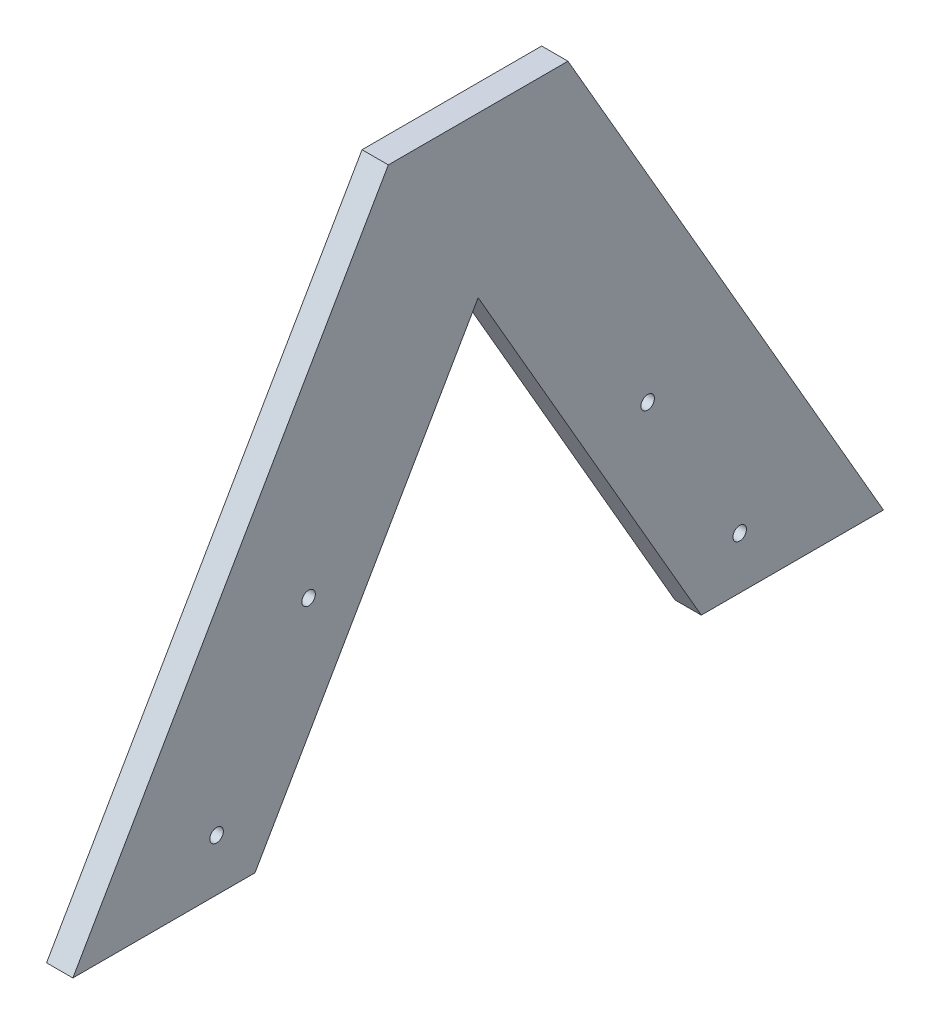
ISO-10303-21;
HEADER;
FILE_DESCRIPTION(('STEP AP214'),'2;1');
FILE_NAME('part.step','',(''),(''),'','','');
FILE_SCHEMA(('AUTOMOTIVE_DESIGN { 1 0 10303 214 1 1 1 1 }'));
ENDSEC;
DATA;
#1=APPLICATION_CONTEXT('core data for automotive mechanical design processes');
#2=APPLICATION_PROTOCOL_DEFINITION('international standard','automotive_design',2000,#1);
#3=PRODUCT_CONTEXT('',#1,'mechanical');
#4=PRODUCT('Part','Part','',(#3));
#5=PRODUCT_RELATED_PRODUCT_CATEGORY('part','',(#4));
#6=PRODUCT_DEFINITION_FORMATION('','',#4);
#7=PRODUCT_DEFINITION_CONTEXT('part definition',#1,'design');
#8=PRODUCT_DEFINITION('design','',#6,#7);
#9=PRODUCT_DEFINITION_SHAPE('','',#8);
#10=(LENGTH_UNIT() NAMED_UNIT(*) SI_UNIT(.MILLI.,.METRE.));
#11=(NAMED_UNIT(*) PLANE_ANGLE_UNIT() SI_UNIT($,.RADIAN.));
#12=(NAMED_UNIT(*) SI_UNIT($,.STERADIAN.) SOLID_ANGLE_UNIT());
#13=UNCERTAINTY_MEASURE_WITH_UNIT(LENGTH_MEASURE(1.E-05),#10,'distance_accuracy_value','');
#14=(GEOMETRIC_REPRESENTATION_CONTEXT(3) GLOBAL_UNCERTAINTY_ASSIGNED_CONTEXT((#13)) GLOBAL_UNIT_ASSIGNED_CONTEXT((#10,
#11,#12)) REPRESENTATION_CONTEXT('',''));
#15=CARTESIAN_POINT('',(0.,0.,0.));
#16=DIRECTION('',(0.,0.,1.));
#17=DIRECTION('',(1.,0.,0.));
#18=AXIS2_PLACEMENT_3D('',#15,#16,#17);
#19=CARTESIAN_POINT('',(6.35,0.,0.));
#20=DIRECTION('',(0.,1.,0.));
#21=DIRECTION('',(0.,0.,1.));
#22=AXIS2_PLACEMENT_3D('',#19,#20,#21);
#23=PLANE('',#22);
#24=DIRECTION('',(0.,0.,-1.));
#25=VECTOR('',#24,1.);
#26=CARTESIAN_POINT('',(0.,0.,0.));
#27=LINE('',#26,#25);
#28=CARTESIAN_POINT('',(0.,0.,0.));
#29=VERTEX_POINT('',#28);
#30=CARTESIAN_POINT('',(0.,0.,-43.9940905122494));
#31=VERTEX_POINT('',#30);
#32=EDGE_CURVE('E135',#29,#31,#27,.T.);
#33=ORIENTED_EDGE('',*,*,#32,.T.);
#34=DIRECTION('',(-1.,0.,0.));
#35=VECTOR('',#34,1.);
#36=CARTESIAN_POINT('',(6.35,0.,-43.9940905122494));
#37=LINE('',#36,#35);
#38=CARTESIAN_POINT('',(6.35,0.,-43.9940905122494));
#39=VERTEX_POINT('',#38);
#40=EDGE_CURVE('E11',#39,#31,#37,.T.);
#41=ORIENTED_EDGE('',*,*,#40,.F.);
#42=DIRECTION('',(0.,0.,-1.));
#43=VECTOR('',#42,1.);
#44=CARTESIAN_POINT('',(6.35,0.,0.));
#45=LINE('',#44,#43);
#46=CARTESIAN_POINT('',(6.35,0.,0.));
#47=VERTEX_POINT('',#46);
#48=EDGE_CURVE('E151',#47,#39,#45,.T.);
#49=ORIENTED_EDGE('',*,*,#48,.F.);
#50=DIRECTION('',(-1.,0.,0.));
#51=VECTOR('',#50,1.);
#52=CARTESIAN_POINT('',(6.35,0.,0.));
#53=LINE('',#52,#51);
#54=EDGE_CURVE('E131',#47,#29,#53,.T.);
#55=ORIENTED_EDGE('',*,*,#54,.T.);
#56=EDGE_LOOP('',(#33,#41,#49,#55));
#57=FACE_BOUND('',#56,.T.);
#58=ADVANCED_FACE('F39',(#57),#23,.F.);
#59=CARTESIAN_POINT('',(6.35,0.,-43.9940905122494));
#60=DIRECTION('',(0.,0.499999999999996,0.866025403784441));
#61=DIRECTION('',(0.,-0.866025403784441,0.499999999999996));
#62=AXIS2_PLACEMENT_3D('',#59,#60,#61);
#63=PLANE('',#62);
#64=DIRECTION('',(0.,0.866025403784441,-0.499999999999996));
#65=VECTOR('',#64,1.);
#66=CARTESIAN_POINT('',(0.,0.,-43.9940905122494));
#67=LINE('',#66,#65);
#68=CARTESIAN_POINT('',(0.,93.3557217066508,-97.8930415699754));
#69=VERTEX_POINT('',#68);
#70=EDGE_CURVE('E139',#31,#69,#67,.T.);
#71=ORIENTED_EDGE('',*,*,#70,.T.);
#72=DIRECTION('',(-1.,0.,0.));
#73=VECTOR('',#72,1.);
#74=CARTESIAN_POINT('',(6.35,93.3557217066508,-97.8930415699754));
#75=LINE('',#74,#73);
#76=CARTESIAN_POINT('',(6.35,93.3557217066508,-97.8930415699754));
#77=VERTEX_POINT('',#76);
#78=EDGE_CURVE('E48',#77,#69,#75,.T.);
#79=ORIENTED_EDGE('',*,*,#78,.F.);
#80=DIRECTION('',(0.,0.866025403784441,-0.499999999999996));
#81=VECTOR('',#80,1.);
#82=CARTESIAN_POINT('',(6.35,0.,-43.9940905122494));
#83=LINE('',#82,#81);
#84=EDGE_CURVE('E100',#39,#77,#83,.T.);
#85=ORIENTED_EDGE('',*,*,#84,.F.);
#86=ORIENTED_EDGE('',*,*,#40,.T.);
#87=EDGE_LOOP('',(#71,#79,#85,#86));
#88=FACE_BOUND('',#87,.T.);
#89=ADVANCED_FACE('F244',(#88),#63,.F.);
#90=CARTESIAN_POINT('',(6.35,93.3557217066508,-97.8930415699754));
#91=DIRECTION('',(0.,0.499999999999998,-0.86602540378444));
#92=DIRECTION('',(0.,0.86602540378444,0.499999999999998));
#93=AXIS2_PLACEMENT_3D('',#90,#91,#92);
#94=PLANE('',#93);
#95=DIRECTION('',(0.,-0.86602540378444,-0.499999999999998));
#96=VECTOR('',#95,1.);
#97=CARTESIAN_POINT('',(0.,93.3557217066508,-97.8930415699754));
#98=LINE('',#97,#96);
#99=CARTESIAN_POINT('',(0.,-3.8421819742332E-13,-151.791992627702));
#100=VERTEX_POINT('',#99);
#101=EDGE_CURVE('E143',#69,#100,#98,.T.);
#102=ORIENTED_EDGE('',*,*,#101,.T.);
#103=DIRECTION('',(-1.,0.,0.));
#104=VECTOR('',#103,1.);
#105=CARTESIAN_POINT('',(6.35,-3.8421819742332E-13,-151.791992627702));
#106=LINE('',#105,#104);
#107=CARTESIAN_POINT('',(6.35,-3.8421819742332E-13,-151.791992627702));
#108=VERTEX_POINT('',#107);
#109=EDGE_CURVE('E156',#108,#100,#106,.T.);
#110=ORIENTED_EDGE('',*,*,#109,.F.);
#111=DIRECTION('',(0.,-0.86602540378444,-0.499999999999998));
#112=VECTOR('',#111,1.);
#113=CARTESIAN_POINT('',(6.35,93.3557217066508,-97.8930415699754));
#114=LINE('',#113,#112);
#115=EDGE_CURVE('E164',#77,#108,#114,.T.);
#116=ORIENTED_EDGE('',*,*,#115,.F.);
#117=ORIENTED_EDGE('',*,*,#78,.T.);
#118=EDGE_LOOP('',(#102,#110,#116,#117));
#119=FACE_BOUND('',#118,.T.);
#120=ADVANCED_FACE('F162',(#119),#94,.F.);
#121=CARTESIAN_POINT('',(6.35,-3.8421819742332E-13,-151.791992627702));
#122=DIRECTION('',(0.,1.,0.));
#123=DIRECTION('',(0.,0.,1.));
#124=AXIS2_PLACEMENT_3D('',#121,#122,#123);
#125=PLANE('',#124);
#126=DIRECTION('',(0.,0.,-1.));
#127=VECTOR('',#126,1.);
#128=CARTESIAN_POINT('',(0.,-3.8421819742332E-13,-151.791992627702));
#129=LINE('',#128,#127);
#130=CARTESIAN_POINT('',(0.,-3.8421819742332E-13,-195.786083139951));
#131=VERTEX_POINT('',#130);
#132=EDGE_CURVE('E145',#100,#131,#129,.T.);
#133=ORIENTED_EDGE('',*,*,#132,.T.);
#134=DIRECTION('',(-1.,0.,0.));
#135=VECTOR('',#134,1.);
#136=CARTESIAN_POINT('',(6.35,-3.8421819742332E-13,-195.786083139951));
#137=LINE('',#136,#135);
#138=CARTESIAN_POINT('',(6.35,-3.8421819742332E-13,-195.786083139951));
#139=VERTEX_POINT('',#138);
#140=EDGE_CURVE('E125',#139,#131,#137,.T.);
#141=ORIENTED_EDGE('',*,*,#140,.F.);
#142=DIRECTION('',(0.,0.,-1.));
#143=VECTOR('',#142,1.);
#144=CARTESIAN_POINT('',(6.35,-3.8421819742332E-13,-151.791992627702));
#145=LINE('',#144,#143);
#146=EDGE_CURVE('E116',#108,#139,#145,.T.);
#147=ORIENTED_EDGE('',*,*,#146,.F.);
#148=ORIENTED_EDGE('',*,*,#109,.T.);
#149=EDGE_LOOP('',(#133,#141,#147,#148));
#150=FACE_BOUND('',#149,.T.);
#151=ADVANCED_FACE('F170',(#150),#125,.F.);
#152=CARTESIAN_POINT('',(6.35,131.982271536748,-119.586083139952));
#153=DIRECTION('',(0.,-0.499999999999996,0.866025403784441));
#154=DIRECTION('',(0.,-0.866025403784441,-0.499999999999996));
#155=AXIS2_PLACEMENT_3D('',#152,#153,#154);
#156=PLANE('',#155);
#157=DIRECTION('',(0.,0.866025403784441,0.499999999999996));
#158=VECTOR('',#157,1.);
#159=CARTESIAN_POINT('',(0.,131.982271536748,-119.586083139952));
#160=LINE('',#159,#158);
#161=CARTESIAN_POINT('',(0.,131.982271536748,-119.586083139952));
#162=VERTEX_POINT('',#161);
#163=EDGE_CURVE('E124',#131,#162,#160,.T.);
#164=ORIENTED_EDGE('',*,*,#163,.T.);
#165=DIRECTION('',(-1.,0.,0.));
#166=VECTOR('',#165,1.);
#167=CARTESIAN_POINT('',(6.35,131.982271536748,-119.586083139952));
#168=LINE('',#167,#166);
#169=CARTESIAN_POINT('',(6.35,131.982271536748,-119.586083139952));
#170=VERTEX_POINT('',#169);
#171=EDGE_CURVE('E121',#170,#162,#168,.T.);
#172=ORIENTED_EDGE('',*,*,#171,.F.);
#173=DIRECTION('',(0.,0.866025403784441,0.499999999999996));
#174=VECTOR('',#173,1.);
#175=CARTESIAN_POINT('',(6.35,131.982271536748,-119.586083139952));
#176=LINE('',#175,#174);
#177=EDGE_CURVE('E110',#139,#170,#176,.T.);
#178=ORIENTED_EDGE('',*,*,#177,.F.);
#179=ORIENTED_EDGE('',*,*,#140,.T.);
#180=EDGE_LOOP('',(#164,#172,#178,#179));
#181=FACE_BOUND('',#180,.T.);
#182=ADVANCED_FACE('F122',(#181),#156,.F.);
#183=CARTESIAN_POINT('',(6.35,131.982271536748,-76.2));
#184=DIRECTION('',(0.,-1.,0.));
#185=DIRECTION('',(0.,0.,-1.));
#186=AXIS2_PLACEMENT_3D('',#183,#184,#185);
#187=PLANE('',#186);
#188=DIRECTION('',(0.,0.,1.));
#189=VECTOR('',#188,1.);
#190=CARTESIAN_POINT('',(0.,131.982271536748,-76.2));
#191=LINE('',#190,#189);
#192=CARTESIAN_POINT('',(0.,131.982271536748,-76.2));
#193=VERTEX_POINT('',#192);
#194=EDGE_CURVE('E85',#162,#193,#191,.T.);
#195=ORIENTED_EDGE('',*,*,#194,.T.);
#196=DIRECTION('',(-1.,0.,0.));
#197=VECTOR('',#196,1.);
#198=CARTESIAN_POINT('',(6.35,131.982271536748,-76.2));
#199=LINE('',#198,#197);
#200=CARTESIAN_POINT('',(6.35,131.982271536748,-76.2));
#201=VERTEX_POINT('',#200);
#202=EDGE_CURVE('E126',#201,#193,#199,.T.);
#203=ORIENTED_EDGE('',*,*,#202,.F.);
#204=DIRECTION('',(0.,0.,1.));
#205=VECTOR('',#204,1.);
#206=CARTESIAN_POINT('',(6.35,131.982271536748,-76.2));
#207=LINE('',#206,#205);
#208=EDGE_CURVE('E114',#170,#201,#207,.T.);
#209=ORIENTED_EDGE('',*,*,#208,.F.);
#210=ORIENTED_EDGE('',*,*,#171,.T.);
#211=EDGE_LOOP('',(#195,#203,#209,#210));
#212=FACE_BOUND('',#211,.T.);
#213=ADVANCED_FACE('F128',(#212),#187,.F.);
#214=CARTESIAN_POINT('',(6.35,0.,0.));
#215=DIRECTION('',(0.,-0.5,-0.866025403784439));
#216=DIRECTION('',(0.,0.866025403784439,-0.5));
#217=AXIS2_PLACEMENT_3D('',#214,#215,#216);
#218=PLANE('',#217);
#219=DIRECTION('',(0.,-0.866025403784439,0.5));
#220=VECTOR('',#219,1.);
#221=CARTESIAN_POINT('',(0.,0.,0.));
#222=LINE('',#221,#220);
#223=EDGE_CURVE('E91',#193,#29,#222,.T.);
#224=ORIENTED_EDGE('',*,*,#223,.T.);
#225=ORIENTED_EDGE('',*,*,#54,.F.);
#226=DIRECTION('',(0.,-0.866025403784439,0.5));
#227=VECTOR('',#226,1.);
#228=CARTESIAN_POINT('',(6.35,0.,0.));
#229=LINE('',#228,#227);
#230=EDGE_CURVE('E59',#201,#47,#229,.T.);
#231=ORIENTED_EDGE('',*,*,#230,.F.);
#232=ORIENTED_EDGE('',*,*,#202,.T.);
#233=EDGE_LOOP('',(#224,#225,#231,#232));
#234=FACE_BOUND('',#233,.T.);
#235=ADVANCED_FACE('F252',(#234),#218,.F.);
#236=CARTESIAN_POINT('',(6.35,0.,0.));
#237=DIRECTION('',(1.,0.,0.));
#238=DIRECTION('',(0.,0.,-1.));
#239=AXIS2_PLACEMENT_3D('',#236,#237,#238);
#240=PLANE('',#239);
#241=CARTESIAN_POINT('',(6.35,12.5112906821517,-161.066379526545));
#242=DIRECTION('',(-1.,0.,0.));
#243=DIRECTION('',(0.,0.,1.));
#244=AXIS2_PLACEMENT_3D('',#241,#242,#243);
#245=CIRCLE('',#244,1.63195);
#246=CARTESIAN_POINT('',(6.35,12.5112906821517,-159.434429526545));
#247=VERTEX_POINT('',#246);
#248=EDGE_CURVE('E206',#247,#247,#245,.T.);
#249=ORIENTED_EDGE('',*,*,#248,.T.);
#250=EDGE_LOOP('',(#249));
#251=FACE_BOUND('',#250,.T.);
#252=CARTESIAN_POINT('',(6.35,51.00611988037,-138.841379526545));
#253=DIRECTION('',(-1.,0.,0.));
#254=DIRECTION('',(0.,0.,1.));
#255=AXIS2_PLACEMENT_3D('',#252,#253,#254);
#256=CIRCLE('',#255,1.63194999999999);
#257=CARTESIAN_POINT('',(6.35,51.00611988037,-137.209429526545));
#258=VERTEX_POINT('',#257);
#259=EDGE_CURVE('E197',#258,#258,#256,.T.);
#260=ORIENTED_EDGE('',*,*,#259,.T.);
#261=EDGE_LOOP('',(#260));
#262=FACE_BOUND('',#261,.T.);
#263=CARTESIAN_POINT('',(6.35,51.0061198803714,-56.9447036134043));
#264=DIRECTION('',(-1.,0.,0.));
#265=DIRECTION('',(0.,0.,1.));
#266=AXIS2_PLACEMENT_3D('',#263,#264,#265);
#267=CIRCLE('',#266,1.63194999999999);
#268=CARTESIAN_POINT('',(6.35,51.0061198803714,-55.3127536134043));
#269=VERTEX_POINT('',#268);
#270=EDGE_CURVE('E188',#269,#269,#267,.T.);
#271=ORIENTED_EDGE('',*,*,#270,.T.);
#272=EDGE_LOOP('',(#271));
#273=FACE_BOUND('',#272,.T.);
#274=CARTESIAN_POINT('',(6.35,12.5112906821524,-34.7197036134054));
#275=DIRECTION('',(-1.,0.,0.));
#276=DIRECTION('',(0.,0.,1.));
#277=AXIS2_PLACEMENT_3D('',#274,#275,#276);
#278=CIRCLE('',#277,1.63195);
#279=CARTESIAN_POINT('',(6.35,12.5112906821524,-33.0877536134054));
#280=VERTEX_POINT('',#279);
#281=EDGE_CURVE('E140',#280,#280,#278,.T.);
#282=ORIENTED_EDGE('',*,*,#281,.T.);
#283=EDGE_LOOP('',(#282));
#284=FACE_BOUND('',#283,.T.);
#285=ORIENTED_EDGE('',*,*,#48,.T.);
#286=ORIENTED_EDGE('',*,*,#84,.T.);
#287=ORIENTED_EDGE('',*,*,#115,.T.);
#288=ORIENTED_EDGE('',*,*,#146,.T.);
#289=ORIENTED_EDGE('',*,*,#177,.T.);
#290=ORIENTED_EDGE('',*,*,#208,.T.);
#291=ORIENTED_EDGE('',*,*,#230,.T.);
#292=EDGE_LOOP('',(#285,#286,#287,#288,#289,#290,#291));
#293=FACE_BOUND('',#292,.T.);
#294=ADVANCED_FACE('F112',(#251,#262,#273,#284,#293),#240,.T.);
#295=CARTESIAN_POINT('',(0.,0.,0.));
#296=DIRECTION('',(1.,0.,0.));
#297=DIRECTION('',(0.,0.,-1.));
#298=AXIS2_PLACEMENT_3D('',#295,#296,#297);
#299=PLANE('',#298);
#300=CARTESIAN_POINT('',(0.,12.5112906821517,-161.066379526545));
#301=DIRECTION('',(-1.,0.,0.));
#302=DIRECTION('',(0.,0.,1.));
#303=AXIS2_PLACEMENT_3D('',#300,#301,#302);
#304=CIRCLE('',#303,2.8575);
#305=CARTESIAN_POINT('',(0.,12.5112906821517,-158.208879526545));
#306=VERTEX_POINT('',#305);
#307=EDGE_CURVE('E212',#306,#306,#304,.T.);
#308=ORIENTED_EDGE('',*,*,#307,.F.);
#309=EDGE_LOOP('',(#308));
#310=FACE_BOUND('',#309,.T.);
#311=CARTESIAN_POINT('',(0.,51.00611988037,-138.841379526545));
#312=DIRECTION('',(-1.,0.,0.));
#313=DIRECTION('',(0.,0.,1.));
#314=AXIS2_PLACEMENT_3D('',#311,#312,#313);
#315=CIRCLE('',#314,2.8575);
#316=CARTESIAN_POINT('',(0.,51.00611988037,-135.983879526545));
#317=VERTEX_POINT('',#316);
#318=EDGE_CURVE('E203',#317,#317,#315,.T.);
#319=ORIENTED_EDGE('',*,*,#318,.F.);
#320=EDGE_LOOP('',(#319));
#321=FACE_BOUND('',#320,.T.);
#322=CARTESIAN_POINT('',(0.,51.0061198803714,-56.9447036134043));
#323=DIRECTION('',(-1.,0.,0.));
#324=DIRECTION('',(0.,0.,1.));
#325=AXIS2_PLACEMENT_3D('',#322,#323,#324);
#326=CIRCLE('',#325,2.8575);
#327=CARTESIAN_POINT('',(0.,51.0061198803714,-54.0872036134043));
#328=VERTEX_POINT('',#327);
#329=EDGE_CURVE('E194',#328,#328,#326,.T.);
#330=ORIENTED_EDGE('',*,*,#329,.F.);
#331=EDGE_LOOP('',(#330));
#332=FACE_BOUND('',#331,.T.);
#333=CARTESIAN_POINT('',(0.,12.5112906821524,-34.7197036134054));
#334=DIRECTION('',(-1.,0.,0.));
#335=DIRECTION('',(0.,0.,1.));
#336=AXIS2_PLACEMENT_3D('',#333,#334,#335);
#337=CIRCLE('',#336,2.8575);
#338=CARTESIAN_POINT('',(0.,12.5112906821524,-31.8622036134054));
#339=VERTEX_POINT('',#338);
#340=EDGE_CURVE('E184',#339,#339,#337,.T.);
#341=ORIENTED_EDGE('',*,*,#340,.F.);
#342=EDGE_LOOP('',(#341));
#343=FACE_BOUND('',#342,.T.);
#344=ORIENTED_EDGE('',*,*,#32,.F.);
#345=ORIENTED_EDGE('',*,*,#223,.F.);
#346=ORIENTED_EDGE('',*,*,#194,.F.);
#347=ORIENTED_EDGE('',*,*,#163,.F.);
#348=ORIENTED_EDGE('',*,*,#132,.F.);
#349=ORIENTED_EDGE('',*,*,#101,.F.);
#350=ORIENTED_EDGE('',*,*,#70,.F.);
#351=EDGE_LOOP('',(#344,#345,#346,#347,#348,#349,#350));
#352=FACE_BOUND('',#351,.T.);
#353=ADVANCED_FACE('F168',(#310,#321,#332,#343,#352),#299,.F.);
#354=CARTESIAN_POINT('',(0.,12.5112906821524,-34.7197036134054));
#355=DIRECTION('',(-1.,0.,0.));
#356=DIRECTION('',(0.,0.,1.));
#357=AXIS2_PLACEMENT_3D('',#354,#355,#356);
#358=CYLINDRICAL_SURFACE('',#357,1.63194999999999);
#359=ORIENTED_EDGE('',*,*,#281,.F.);
#360=EDGE_LOOP('',(#359));
#361=FACE_BOUND('',#360,.T.);
#362=CARTESIAN_POINT('',(1.40983400146974,12.5112906821524,-34.7197036134054));
#363=DIRECTION('',(-1.,0.,0.));
#364=DIRECTION('',(0.,0.,1.));
#365=AXIS2_PLACEMENT_3D('',#362,#363,#364);
#366=CIRCLE('',#365,1.63194999999999);
#367=CARTESIAN_POINT('',(1.40983400146974,12.5112906821524,-33.0877536134054));
#368=VERTEX_POINT('',#367);
#369=EDGE_CURVE('E180',#368,#368,#366,.T.);
#370=ORIENTED_EDGE('',*,*,#369,.T.);
#371=EDGE_LOOP('',(#370));
#372=FACE_BOUND('',#371,.T.);
#373=ADVANCED_FACE('F220',(#361,#372),#358,.F.);
#374=CARTESIAN_POINT('',(0.,12.5112906821524,-34.7197036134054));
#375=DIRECTION('',(-1.,0.,0.));
#376=DIRECTION('',(0.,0.,1.));
#377=AXIS2_PLACEMENT_3D('',#374,#375,#376);
#378=CONICAL_SURFACE('',#377,2.8575,0.715584993317668);
#379=ORIENTED_EDGE('',*,*,#369,.F.);
#380=EDGE_LOOP('',(#379));
#381=FACE_BOUND('',#380,.T.);
#382=ORIENTED_EDGE('',*,*,#340,.T.);
#383=EDGE_LOOP('',(#382));
#384=FACE_BOUND('',#383,.T.);
#385=ADVANCED_FACE('F228',(#381,#384),#378,.F.);
#386=CARTESIAN_POINT('',(0.,51.0061198803714,-56.9447036134043));
#387=DIRECTION('',(-1.,0.,0.));
#388=DIRECTION('',(0.,0.,1.));
#389=AXIS2_PLACEMENT_3D('',#386,#387,#388);
#390=CYLINDRICAL_SURFACE('',#389,1.63194999999999);
#391=ORIENTED_EDGE('',*,*,#270,.F.);
#392=EDGE_LOOP('',(#391));
#393=FACE_BOUND('',#392,.T.);
#394=CARTESIAN_POINT('',(1.40983400146974,51.0061198803714,-56.9447036134043));
#395=DIRECTION('',(-1.,0.,0.));
#396=DIRECTION('',(0.,0.,1.));
#397=AXIS2_PLACEMENT_3D('',#394,#395,#396);
#398=CIRCLE('',#397,1.63194999999999);
#399=CARTESIAN_POINT('',(1.40983400146974,51.0061198803714,-55.3127536134043));
#400=VERTEX_POINT('',#399);
#401=EDGE_CURVE('E191',#400,#400,#398,.T.);
#402=ORIENTED_EDGE('',*,*,#401,.T.);
#403=EDGE_LOOP('',(#402));
#404=FACE_BOUND('',#403,.T.);
#405=ADVANCED_FACE('F230',(#393,#404),#390,.F.);
#406=CARTESIAN_POINT('',(0.,51.0061198803714,-56.9447036134043));
#407=DIRECTION('',(-1.,0.,0.));
#408=DIRECTION('',(0.,0.,1.));
#409=AXIS2_PLACEMENT_3D('',#406,#407,#408);
#410=CONICAL_SURFACE('',#409,2.8575,0.715584993317669);
#411=ORIENTED_EDGE('',*,*,#401,.F.);
#412=EDGE_LOOP('',(#411));
#413=FACE_BOUND('',#412,.T.);
#414=ORIENTED_EDGE('',*,*,#329,.T.);
#415=EDGE_LOOP('',(#414));
#416=FACE_BOUND('',#415,.T.);
#417=ADVANCED_FACE('F237',(#413,#416),#410,.F.);
#418=CARTESIAN_POINT('',(0.,51.00611988037,-138.841379526545));
#419=DIRECTION('',(-1.,0.,0.));
#420=DIRECTION('',(0.,0.,1.));
#421=AXIS2_PLACEMENT_3D('',#418,#419,#420);
#422=CYLINDRICAL_SURFACE('',#421,1.63194999999999);
#423=ORIENTED_EDGE('',*,*,#259,.F.);
#424=EDGE_LOOP('',(#423));
#425=FACE_BOUND('',#424,.T.);
#426=CARTESIAN_POINT('',(1.40983400146974,51.00611988037,-138.841379526545));
#427=DIRECTION('',(-1.,0.,0.));
#428=DIRECTION('',(0.,0.,1.));
#429=AXIS2_PLACEMENT_3D('',#426,#427,#428);
#430=CIRCLE('',#429,1.63194999999999);
#431=CARTESIAN_POINT('',(1.40983400146974,51.00611988037,-137.209429526545));
#432=VERTEX_POINT('',#431);
#433=EDGE_CURVE('E200',#432,#432,#430,.T.);
#434=ORIENTED_EDGE('',*,*,#433,.T.);
#435=EDGE_LOOP('',(#434));
#436=FACE_BOUND('',#435,.T.);
#437=ADVANCED_FACE('F323',(#425,#436),#422,.F.);
#438=CARTESIAN_POINT('',(0.,51.00611988037,-138.841379526545));
#439=DIRECTION('',(-1.,0.,0.));
#440=DIRECTION('',(0.,0.,1.));
#441=AXIS2_PLACEMENT_3D('',#438,#439,#440);
#442=CONICAL_SURFACE('',#441,2.8575,0.715584993317669);
#443=ORIENTED_EDGE('',*,*,#433,.F.);
#444=EDGE_LOOP('',(#443));
#445=FACE_BOUND('',#444,.T.);
#446=ORIENTED_EDGE('',*,*,#318,.T.);
#447=EDGE_LOOP('',(#446));
#448=FACE_BOUND('',#447,.T.);
#449=ADVANCED_FACE('F333',(#445,#448),#442,.F.);
#450=CARTESIAN_POINT('',(0.,12.5112906821517,-161.066379526545));
#451=DIRECTION('',(-1.,0.,0.));
#452=DIRECTION('',(0.,0.,1.));
#453=AXIS2_PLACEMENT_3D('',#450,#451,#452);
#454=CYLINDRICAL_SURFACE('',#453,1.63194999999999);
#455=ORIENTED_EDGE('',*,*,#248,.F.);
#456=EDGE_LOOP('',(#455));
#457=FACE_BOUND('',#456,.T.);
#458=CARTESIAN_POINT('',(1.40983400146974,12.5112906821517,-161.066379526545));
#459=DIRECTION('',(-1.,0.,0.));
#460=DIRECTION('',(0.,0.,1.));
#461=AXIS2_PLACEMENT_3D('',#458,#459,#460);
#462=CIRCLE('',#461,1.63194999999999);
#463=CARTESIAN_POINT('',(1.40983400146974,12.5112906821517,-159.434429526545));
#464=VERTEX_POINT('',#463);
#465=EDGE_CURVE('E209',#464,#464,#462,.T.);
#466=ORIENTED_EDGE('',*,*,#465,.T.);
#467=EDGE_LOOP('',(#466));
#468=FACE_BOUND('',#467,.T.);
#469=ADVANCED_FACE('F343',(#457,#468),#454,.F.);
#470=CARTESIAN_POINT('',(0.,12.5112906821517,-161.066379526545));
#471=DIRECTION('',(-1.,0.,0.));
#472=DIRECTION('',(0.,0.,1.));
#473=AXIS2_PLACEMENT_3D('',#470,#471,#472);
#474=CONICAL_SURFACE('',#473,2.8575,0.715584993317668);
#475=ORIENTED_EDGE('',*,*,#465,.F.);
#476=EDGE_LOOP('',(#475));
#477=FACE_BOUND('',#476,.T.);
#478=ORIENTED_EDGE('',*,*,#307,.T.);
#479=EDGE_LOOP('',(#478));
#480=FACE_BOUND('',#479,.T.);
#481=ADVANCED_FACE('F216',(#477,#480),#474,.F.);
#482=CLOSED_SHELL('',(#58,#89,#120,#151,#182,#213,#235,#294,#353,#373,#385,#405,#417,#437,#449,
#469,#481));
#483=MANIFOLD_SOLID_BREP('B2',#482);
#484=ADVANCED_BREP_SHAPE_REPRESENTATION('',(#18,#483),#14);
#485=SHAPE_DEFINITION_REPRESENTATION(#9,#484);
ENDSEC;
END-ISO-10303-21;
